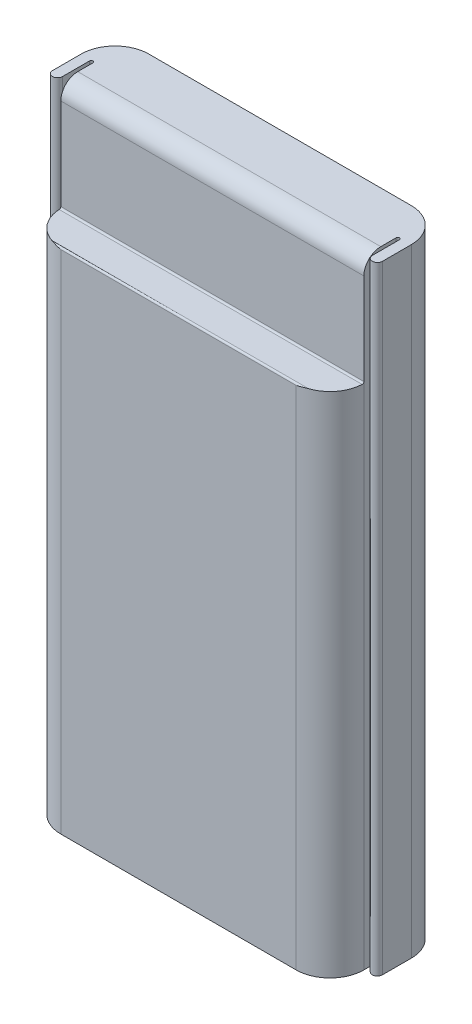
ISO-10303-21;
HEADER;
FILE_DESCRIPTION(('STEP AP214'),'2;1');
FILE_NAME('part.step','',(''),(''),'','','');
FILE_SCHEMA(('AUTOMOTIVE_DESIGN { 1 0 10303 214 1 1 1 1 }'));
ENDSEC;
DATA;
#1=APPLICATION_CONTEXT('core data for automotive mechanical design processes');
#2=APPLICATION_PROTOCOL_DEFINITION('international standard','automotive_design',2000,#1);
#3=PRODUCT_CONTEXT('',#1,'mechanical');
#4=PRODUCT('Part','Part','',(#3));
#5=PRODUCT_RELATED_PRODUCT_CATEGORY('part','',(#4));
#6=PRODUCT_DEFINITION_FORMATION('','',#4);
#7=PRODUCT_DEFINITION_CONTEXT('part definition',#1,'design');
#8=PRODUCT_DEFINITION('design','',#6,#7);
#9=PRODUCT_DEFINITION_SHAPE('','',#8);
#10=(LENGTH_UNIT() NAMED_UNIT(*) SI_UNIT(.MILLI.,.METRE.));
#11=(NAMED_UNIT(*) PLANE_ANGLE_UNIT() SI_UNIT($,.RADIAN.));
#12=(NAMED_UNIT(*) SI_UNIT($,.STERADIAN.) SOLID_ANGLE_UNIT());
#13=UNCERTAINTY_MEASURE_WITH_UNIT(LENGTH_MEASURE(1.E-05),#10,'distance_accuracy_value','');
#14=(GEOMETRIC_REPRESENTATION_CONTEXT(3) GLOBAL_UNCERTAINTY_ASSIGNED_CONTEXT((#13)) GLOBAL_UNIT_ASSIGNED_CONTEXT((#10,
#11,#12)) REPRESENTATION_CONTEXT('',''));
#15=CARTESIAN_POINT('',(0.,0.,0.));
#16=DIRECTION('',(0.,0.,1.));
#17=DIRECTION('',(1.,0.,0.));
#18=AXIS2_PLACEMENT_3D('',#15,#16,#17);
#19=CARTESIAN_POINT('',(-8.95,18.25,4.));
#20=DIRECTION('',(1.,0.,0.));
#21=DIRECTION('',(0.,0.,-1.));
#22=AXIS2_PLACEMENT_3D('',#19,#20,#21);
#23=PLANE('',#22);
#24=CARTESIAN_POINT('',(-8.95,17.25,3.));
#25=DIRECTION('',(1.,0.,0.));
#26=DIRECTION('',(0.,0.,-1.));
#27=AXIS2_PLACEMENT_3D('',#24,#25,#26);
#28=CIRCLE('',#27,1.);
#29=CARTESIAN_POINT('',(-8.95,18.25,3.));
#30=VERTEX_POINT('',#29);
#31=CARTESIAN_POINT('',(-8.95,17.25,4.));
#32=VERTEX_POINT('',#31);
#33=EDGE_CURVE('E452',#30,#32,#28,.T.);
#34=ORIENTED_EDGE('',*,*,#33,.F.);
#35=DIRECTION('',(0.,0.,1.));
#36=VECTOR('',#35,1.);
#37=CARTESIAN_POINT('',(-8.95,18.25,4.));
#38=LINE('',#37,#36);
#39=CARTESIAN_POINT('',(-8.95,18.25,2.1));
#40=VERTEX_POINT('',#39);
#41=EDGE_CURVE('E268',#40,#30,#38,.T.);
#42=ORIENTED_EDGE('',*,*,#41,.F.);
#43=DIRECTION('',(0.,-1.,0.));
#44=VECTOR('',#43,1.);
#45=CARTESIAN_POINT('',(-8.95,18.25,2.1));
#46=LINE('',#45,#44);
#47=CARTESIAN_POINT('',(-8.95,-18.25,2.1));
#48=VERTEX_POINT('',#47);
#49=EDGE_CURVE('E236',#40,#48,#46,.T.);
#50=ORIENTED_EDGE('',*,*,#49,.T.);
#51=DIRECTION('',(0.,0.,1.));
#52=VECTOR('',#51,1.);
#53=CARTESIAN_POINT('',(-8.95,-18.25,4.));
#54=LINE('',#53,#52);
#55=CARTESIAN_POINT('',(-8.95,-18.25,4.));
#56=VERTEX_POINT('',#55);
#57=EDGE_CURVE('E191',#48,#56,#54,.T.);
#58=ORIENTED_EDGE('',*,*,#57,.T.);
#59=DIRECTION('',(0.,-1.,0.));
#60=VECTOR('',#59,1.);
#61=CARTESIAN_POINT('',(-8.95,18.25,4.));
#62=LINE('',#61,#60);
#63=CARTESIAN_POINT('',(-8.95,11.85,4.));
#64=VERTEX_POINT('',#63);
#65=EDGE_CURVE('E234',#64,#56,#62,.T.);
#66=ORIENTED_EDGE('',*,*,#65,.F.);
#67=DIRECTION('',(0.,-1.,0.));
#68=VECTOR('',#67,1.);
#69=CARTESIAN_POINT('',(-8.95,18.25,4.));
#70=LINE('',#69,#68);
#71=EDGE_CURVE('E435',#32,#64,#70,.T.);
#72=ORIENTED_EDGE('',*,*,#71,.F.);
#73=EDGE_LOOP('',(#34,#42,#50,#58,#66,#72));
#74=FACE_BOUND('',#73,.T.);
#75=ADVANCED_FACE('F35',(#74),#23,.F.);
#76=CARTESIAN_POINT('',(-6.95,18.25,4.));
#77=DIRECTION('',(0.,-1.,0.));
#78=DIRECTION('',(0.,0.,-1.));
#79=AXIS2_PLACEMENT_3D('',#76,#77,#78);
#80=CYLINDRICAL_SURFACE('',#79,2.);
#81=CARTESIAN_POINT('',(-8.95,11.85,4.));
#82=CARTESIAN_POINT('',(-8.94999932422517,11.8443743102239,3.99999522201878));
#83=CARTESIAN_POINT('',(-8.94999998904104,11.8387500464261,4.00047444004767));
#84=CARTESIAN_POINT('',(-8.94999900312955,11.8276648866069,4.00236561548896));
#85=CARTESIAN_POINT('',(-8.94999735420724,11.822203866626,4.00377684534849));
#86=CARTESIAN_POINT('',(-8.94998675606316,11.8115938955208,4.00749778863902));
#87=CARTESIAN_POINT('',(-8.94997780332464,11.8064450960132,4.00980793461507));
#88=CARTESIAN_POINT('',(-8.94994365144838,11.7966092606749,4.01525910036643));
#89=CARTESIAN_POINT('',(-8.94991845516527,11.7919221438755,4.01839997409343));
#90=CARTESIAN_POINT('',(-8.94984147568946,11.7831423208407,4.02542348470254));
#91=CARTESIAN_POINT('',(-8.94978969553752,11.7790495466912,4.02930603671727));
#92=CARTESIAN_POINT('',(-8.9496489797193,11.771573258672,4.03770353610332));
#93=CARTESIAN_POINT('',(-8.94956003717822,11.7681898762095,4.04221860038278));
#94=CARTESIAN_POINT('',(-8.94933604675531,11.762230184252,4.05175006414675));
#95=CARTESIAN_POINT('',(-8.94920101025261,11.7596536758662,4.05676633968216));
#96=CARTESIAN_POINT('',(-8.94887888497684,11.7553802774274,4.06715763512218));
#97=CARTESIAN_POINT('',(-8.94869182588129,11.7536828874362,4.07253244916511));
#98=CARTESIAN_POINT('',(-8.94833726279508,11.7516345170711,4.08161655952931));
#99=CARTESIAN_POINT('',(-8.94818479897542,11.7510218606214,4.08526960373832));
#100=CARTESIAN_POINT('',(-8.94785788686203,11.7502046519005,4.09261477614858));
#101=CARTESIAN_POINT('',(-8.9476834703334,11.7499995170115,4.09630684095527));
#102=CARTESIAN_POINT('',(-8.94749843554385,11.7499999999995,4.0999999999999));
#103=B_SPLINE_CURVE_WITH_KNOTS('',3,(#81,#82,#83,#84,#85,#86,#87,#88,#89,#90,#91,#92,#93,#94,
#95,#96,#97,#98,#99,#100,#101,#102),.UNSPECIFIED.,.F.,.F.,(4,2,2,2,2,2,2,2,2,2,4),(0.,
0.0168546524917242,0.0336961633269723,0.0505457880879403,0.0673924525224765,0.0842371904116673,
0.101085045855895,0.117928745104641,0.134762855110015,0.145863232784876,0.156947729226478),.UNSPECIFIED.);
#104=CARTESIAN_POINT('',(-8.94749843554382,11.75,4.1));
#105=VERTEX_POINT('',#104);
#106=EDGE_CURVE('E432',#64,#105,#103,.T.);
#107=ORIENTED_EDGE('',*,*,#106,.F.);
#108=ORIENTED_EDGE('',*,*,#65,.T.);
#109=CARTESIAN_POINT('',(-6.95,-18.25,4.));
#110=DIRECTION('',(0.,1.,0.));
#111=DIRECTION('',(0.,0.,1.));
#112=AXIS2_PLACEMENT_3D('',#109,#110,#111);
#113=CIRCLE('',#112,2.);
#114=CARTESIAN_POINT('',(-6.95,-18.25,6.));
#115=VERTEX_POINT('',#114);
#116=EDGE_CURVE('E194',#56,#115,#113,.T.);
#117=ORIENTED_EDGE('',*,*,#116,.T.);
#118=DIRECTION('',(0.,-1.,0.));
#119=VECTOR('',#118,1.);
#120=CARTESIAN_POINT('',(-6.95,18.25,6.));
#121=LINE('',#120,#119);
#122=CARTESIAN_POINT('',(-6.95,11.65,6.));
#123=VERTEX_POINT('',#122);
#124=EDGE_CURVE('E232',#123,#115,#121,.T.);
#125=ORIENTED_EDGE('',*,*,#124,.F.);
#126=CARTESIAN_POINT('',(-7.57449979983984,11.75,5.9));
#127=CARTESIAN_POINT('',(-7.55856334148589,11.7499927516954,5.90523837613631));
#128=CARTESIAN_POINT('',(-7.54256714931025,11.74958905733,5.91027359012637));
#129=CARTESIAN_POINT('',(-7.51049053402888,11.748117177134,5.91992979603773));
#130=CARTESIAN_POINT('',(-7.4944101692403,11.747049403092,5.92455104262571));
#131=CARTESIAN_POINT('',(-7.44610574696767,11.7430447612974,5.93778043517835));
#132=CARTESIAN_POINT('',(-7.41377882782681,11.7393059211048,5.94576720996326));
#133=CARTESIAN_POINT('',(-7.3113781263724,11.7252140333343,5.96838648267485));
#134=CARTESIAN_POINT('',(-7.24100224492483,11.7122186682412,5.97998574983881));
#135=CARTESIAN_POINT('',(-7.0999810808278,11.6834815244392,5.99563165048736));
#136=CARTESIAN_POINT('',(-7.02933564546196,11.6677378515745,5.99967305238183));
#137=CARTESIAN_POINT('',(-6.95581908702235,11.6513011877615,5.99999364048357));
#138=CARTESIAN_POINT('',(-6.95290950558759,11.6506505834764,5.99999998856282));
#139=CARTESIAN_POINT('',(-6.95,11.65,6.));
#140=B_SPLINE_CURVE_WITH_KNOTS('',3,(#126,#127,#128,#129,#130,#131,#132,#133,#134,#135,#136,
#137,#138,#139),.UNSPECIFIED.,.F.,.F.,(4,2,2,2,2,2,4),(0.,0.0503101558894608,0.100589146054153,
0.201022717159537,0.417919206283149,0.634965776691355,0.643910069210359),.UNSPECIFIED.);
#141=CARTESIAN_POINT('',(-7.57449979983984,11.75,5.9));
#142=VERTEX_POINT('',#141);
#143=EDGE_CURVE('E433',#142,#123,#140,.T.);
#144=ORIENTED_EDGE('',*,*,#143,.F.);
#145=CARTESIAN_POINT('',(-6.95,11.75,4.));
#146=DIRECTION('',(0.,-1.,0.));
#147=DIRECTION('',(0.,0.,-1.));
#148=AXIS2_PLACEMENT_3D('',#145,#146,#147);
#149=CIRCLE('',#148,2.);
#150=EDGE_CURVE('E426',#105,#142,#149,.F.);
#151=ORIENTED_EDGE('',*,*,#150,.F.);
#152=EDGE_LOOP('',(#107,#108,#117,#125,#144,#151));
#153=FACE_BOUND('',#152,.T.);
#154=ADVANCED_FACE('F360',(#153),#80,.T.);
#155=CARTESIAN_POINT('',(6.95,18.25,4.));
#156=DIRECTION('',(0.,-1.,0.));
#157=DIRECTION('',(0.,0.,-1.));
#158=AXIS2_PLACEMENT_3D('',#155,#156,#157);
#159=CYLINDRICAL_SURFACE('',#158,2.);
#160=CARTESIAN_POINT('',(8.95,11.85,4.));
#161=CARTESIAN_POINT('',(8.94999932422517,11.8443743102239,3.99999522201878));
#162=CARTESIAN_POINT('',(8.94999998904103,11.8387500464261,4.00047444004767));
#163=CARTESIAN_POINT('',(8.94999900312954,11.8276648866069,4.00236561548896));
#164=CARTESIAN_POINT('',(8.94999735420723,11.822203866626,4.00377684534849));
#165=CARTESIAN_POINT('',(8.94998675606316,11.8115938955208,4.00749778863902));
#166=CARTESIAN_POINT('',(8.94997780332464,11.8064450960132,4.00980793461507));
#167=CARTESIAN_POINT('',(8.94994365144838,11.7966092606749,4.01525910036643));
#168=CARTESIAN_POINT('',(8.94991845516526,11.7919221438755,4.01839997409343));
#169=CARTESIAN_POINT('',(8.94984147568946,11.7831423208407,4.02542348470254));
#170=CARTESIAN_POINT('',(8.94978969553751,11.7790495466912,4.02930603671727));
#171=CARTESIAN_POINT('',(8.9496489797193,11.771573258672,4.03770353610332));
#172=CARTESIAN_POINT('',(8.94956003717822,11.7681898762095,4.04221860038278));
#173=CARTESIAN_POINT('',(8.9493360467553,11.762230184252,4.05175006414675));
#174=CARTESIAN_POINT('',(8.9492010102526,11.7596536758662,4.05676633968216));
#175=CARTESIAN_POINT('',(8.94887888497684,11.7553802774274,4.06715763512218));
#176=CARTESIAN_POINT('',(8.94869182588128,11.7536828874362,4.07253244916511));
#177=CARTESIAN_POINT('',(8.94833726279507,11.7516345170711,4.08161655952931));
#178=CARTESIAN_POINT('',(8.94818479897542,11.7510218606214,4.08526960373832));
#179=CARTESIAN_POINT('',(8.94785788686202,11.7502046519005,4.09261477614858));
#180=CARTESIAN_POINT('',(8.94768347033339,11.7499995170115,4.09630684095527));
#181=CARTESIAN_POINT('',(8.94749843554384,11.7499999999995,4.0999999999999));
#182=B_SPLINE_CURVE_WITH_KNOTS('',3,(#160,#161,#162,#163,#164,#165,#166,#167,#168,#169,#170,
#171,#172,#173,#174,#175,#176,#177,#178,#179,#180,#181),.UNSPECIFIED.,.F.,.F.,(4,2,2,2,2,2,2,2,
2,2,4),(0.,0.0168546524917242,0.0336961633269723,0.0505457880879403,0.0673924525224765,
0.0842371904116674,0.101085045855895,0.117928745104641,0.134762855110015,0.145863232784877,
0.156947729226477),.UNSPECIFIED.);
#183=CARTESIAN_POINT('',(8.95,11.85,4.));
#184=VERTEX_POINT('',#183);
#185=CARTESIAN_POINT('',(8.94749843554382,11.75,4.1));
#186=VERTEX_POINT('',#185);
#187=EDGE_CURVE('E339',#184,#186,#182,.T.);
#188=ORIENTED_EDGE('',*,*,#187,.T.);
#189=CARTESIAN_POINT('',(6.95,11.75,4.));
#190=DIRECTION('',(0.,1.,0.));
#191=DIRECTION('',(0.,0.,1.));
#192=AXIS2_PLACEMENT_3D('',#189,#190,#191);
#193=CIRCLE('',#192,2.);
#194=CARTESIAN_POINT('',(7.57449979983984,11.75,5.9));
#195=VERTEX_POINT('',#194);
#196=EDGE_CURVE('E325',#186,#195,#193,.F.);
#197=ORIENTED_EDGE('',*,*,#196,.T.);
#198=CARTESIAN_POINT('',(7.57449979983984,11.75,5.9));
#199=CARTESIAN_POINT('',(7.55856334148588,11.7499927516954,5.90523837613631));
#200=CARTESIAN_POINT('',(7.54256714931024,11.74958905733,5.91027359012637));
#201=CARTESIAN_POINT('',(7.51049053402887,11.748117177134,5.91992979603774));
#202=CARTESIAN_POINT('',(7.49441016924029,11.747049403092,5.92455104262571));
#203=CARTESIAN_POINT('',(7.44610574696766,11.7430447612974,5.93778043517835));
#204=CARTESIAN_POINT('',(7.41377882782681,11.7393059211048,5.94576720996326));
#205=CARTESIAN_POINT('',(7.31137812637239,11.7252140333343,5.96838648267485));
#206=CARTESIAN_POINT('',(7.24100224492482,11.7122186682413,5.9799857498388));
#207=CARTESIAN_POINT('',(7.09998108082782,11.6834815244391,5.99563165048736));
#208=CARTESIAN_POINT('',(7.02933564546204,11.6677378515741,5.99967305238184));
#209=CARTESIAN_POINT('',(6.95581908702235,11.6513011877615,5.99999364048357));
#210=CARTESIAN_POINT('',(6.95290950558759,11.6506505834764,5.99999998856282));
#211=CARTESIAN_POINT('',(6.95,11.65,6.));
#212=B_SPLINE_CURVE_WITH_KNOTS('',3,(#198,#199,#200,#201,#202,#203,#204,#205,#206,#207,#208,
#209,#210,#211),.UNSPECIFIED.,.F.,.F.,(4,2,2,2,2,2,4),(0.,0.0503101558894679,0.100589146054166,
0.201022717159536,0.417919206283143,0.634965776691358,0.643910069210361),.UNSPECIFIED.);
#213=CARTESIAN_POINT('',(6.95,11.65,6.));
#214=VERTEX_POINT('',#213);
#215=EDGE_CURVE('E316',#195,#214,#212,.T.);
#216=ORIENTED_EDGE('',*,*,#215,.T.);
#217=DIRECTION('',(0.,-1.,0.));
#218=VECTOR('',#217,1.);
#219=CARTESIAN_POINT('',(6.95,18.25,6.));
#220=LINE('',#219,#218);
#221=CARTESIAN_POINT('',(6.95,-18.25,6.));
#222=VERTEX_POINT('',#221);
#223=EDGE_CURVE('E230',#214,#222,#220,.T.);
#224=ORIENTED_EDGE('',*,*,#223,.T.);
#225=CARTESIAN_POINT('',(6.95,-18.25,4.));
#226=DIRECTION('',(0.,1.,0.));
#227=DIRECTION('',(0.,0.,-1.));
#228=AXIS2_PLACEMENT_3D('',#225,#226,#227);
#229=CIRCLE('',#228,2.);
#230=CARTESIAN_POINT('',(8.95,-18.25,4.));
#231=VERTEX_POINT('',#230);
#232=EDGE_CURVE('E200',#222,#231,#229,.T.);
#233=ORIENTED_EDGE('',*,*,#232,.T.);
#234=DIRECTION('',(0.,-1.,0.));
#235=VECTOR('',#234,1.);
#236=CARTESIAN_POINT('',(8.95,18.25,4.));
#237=LINE('',#236,#235);
#238=EDGE_CURVE('E228',#184,#231,#237,.T.);
#239=ORIENTED_EDGE('',*,*,#238,.F.);
#240=EDGE_LOOP('',(#188,#197,#216,#224,#233,#239));
#241=FACE_BOUND('',#240,.T.);
#242=ADVANCED_FACE('F366',(#241),#159,.T.);
#243=CARTESIAN_POINT('',(8.95,18.25,2.1));
#244=DIRECTION('',(-1.,0.,0.));
#245=DIRECTION('',(0.,0.,1.));
#246=AXIS2_PLACEMENT_3D('',#243,#244,#245);
#247=PLANE('',#246);
#248=CARTESIAN_POINT('',(8.95,17.25,3.));
#249=DIRECTION('',(-1.,0.,0.));
#250=DIRECTION('',(0.,0.,1.));
#251=AXIS2_PLACEMENT_3D('',#248,#249,#250);
#252=CIRCLE('',#251,1.);
#253=CARTESIAN_POINT('',(8.95,18.25,3.));
#254=VERTEX_POINT('',#253);
#255=CARTESIAN_POINT('',(8.95,17.25,4.));
#256=VERTEX_POINT('',#255);
#257=EDGE_CURVE('E50',#254,#256,#252,.F.);
#258=ORIENTED_EDGE('',*,*,#257,.T.);
#259=DIRECTION('',(0.,-1.,0.));
#260=VECTOR('',#259,1.);
#261=CARTESIAN_POINT('',(8.95,17.25,4.));
#262=LINE('',#261,#260);
#263=EDGE_CURVE('E183',#256,#184,#262,.T.);
#264=ORIENTED_EDGE('',*,*,#263,.T.);
#265=ORIENTED_EDGE('',*,*,#238,.T.);
#266=DIRECTION('',(0.,0.,-1.));
#267=VECTOR('',#266,1.);
#268=CARTESIAN_POINT('',(8.95,-18.25,2.1));
#269=LINE('',#268,#267);
#270=CARTESIAN_POINT('',(8.95,-18.25,2.1));
#271=VERTEX_POINT('',#270);
#272=EDGE_CURVE('E203',#231,#271,#269,.T.);
#273=ORIENTED_EDGE('',*,*,#272,.T.);
#274=DIRECTION('',(0.,-1.,0.));
#275=VECTOR('',#274,1.);
#276=CARTESIAN_POINT('',(8.95,18.25,2.1));
#277=LINE('',#276,#275);
#278=CARTESIAN_POINT('',(8.95,18.25,2.1));
#279=VERTEX_POINT('',#278);
#280=EDGE_CURVE('E225',#279,#271,#277,.T.);
#281=ORIENTED_EDGE('',*,*,#280,.F.);
#282=DIRECTION('',(0.,0.,-1.));
#283=VECTOR('',#282,1.);
#284=CARTESIAN_POINT('',(8.95,18.25,2.1));
#285=LINE('',#284,#283);
#286=EDGE_CURVE('E271',#254,#279,#285,.T.);
#287=ORIENTED_EDGE('',*,*,#286,.F.);
#288=EDGE_LOOP('',(#258,#264,#265,#273,#281,#287));
#289=FACE_BOUND('',#288,.T.);
#290=ADVANCED_FACE('F383',(#289),#247,.F.);
#291=CARTESIAN_POINT('',(-7.75,18.25,2.));
#292=DIRECTION('',(0.,-1.,0.));
#293=DIRECTION('',(0.,0.,-1.));
#294=AXIS2_PLACEMENT_3D('',#291,#292,#293);
#295=CYLINDRICAL_SURFACE('',#294,2.);
#296=CARTESIAN_POINT('',(-7.75,-18.25,2.));
#297=DIRECTION('',(0.,1.,0.));
#298=DIRECTION('',(0.,0.,1.));
#299=AXIS2_PLACEMENT_3D('',#296,#297,#298);
#300=CIRCLE('',#299,2.);
#301=CARTESIAN_POINT('',(-7.75,-18.25,0.));
#302=VERTEX_POINT('',#301);
#303=CARTESIAN_POINT('',(-9.75,-18.25,2.));
#304=VERTEX_POINT('',#303);
#305=EDGE_CURVE('E179',#302,#304,#300,.T.);
#306=ORIENTED_EDGE('',*,*,#305,.T.);
#307=DIRECTION('',(0.,-1.,0.));
#308=VECTOR('',#307,1.);
#309=CARTESIAN_POINT('',(-9.75,18.25,2.));
#310=LINE('',#309,#308);
#311=CARTESIAN_POINT('',(-9.75,18.25,2.));
#312=VERTEX_POINT('',#311);
#313=EDGE_CURVE('E11',#312,#304,#310,.T.);
#314=ORIENTED_EDGE('',*,*,#313,.F.);
#315=CARTESIAN_POINT('',(-7.75,18.25,2.));
#316=DIRECTION('',(0.,1.,0.));
#317=DIRECTION('',(0.,0.,1.));
#318=AXIS2_PLACEMENT_3D('',#315,#316,#317);
#319=CIRCLE('',#318,2.);
#320=CARTESIAN_POINT('',(-7.75,18.25,0.));
#321=VERTEX_POINT('',#320);
#322=EDGE_CURVE('E215',#321,#312,#319,.T.);
#323=ORIENTED_EDGE('',*,*,#322,.F.);
#324=DIRECTION('',(0.,-1.,0.));
#325=VECTOR('',#324,1.);
#326=CARTESIAN_POINT('',(-7.75,18.25,0.));
#327=LINE('',#326,#325);
#328=EDGE_CURVE('E175',#321,#302,#327,.T.);
#329=ORIENTED_EDGE('',*,*,#328,.T.);
#330=EDGE_LOOP('',(#306,#314,#323,#329));
#331=FACE_BOUND('',#330,.T.);
#332=ADVANCED_FACE('F37',(#331),#295,.T.);
#333=CARTESIAN_POINT('',(-9.75,18.25,2.));
#334=DIRECTION('',(1.,0.,0.));
#335=DIRECTION('',(0.,0.,-1.));
#336=AXIS2_PLACEMENT_3D('',#333,#334,#335);
#337=PLANE('',#336);
#338=DIRECTION('',(0.,0.,1.));
#339=VECTOR('',#338,1.);
#340=CARTESIAN_POINT('',(-9.75,-18.25,2.));
#341=LINE('',#340,#339);
#342=CARTESIAN_POINT('',(-9.75,-18.25,3.7));
#343=VERTEX_POINT('',#342);
#344=EDGE_CURVE('E182',#304,#343,#341,.T.);
#345=ORIENTED_EDGE('',*,*,#344,.T.);
#346=DIRECTION('',(0.,-1.,0.));
#347=VECTOR('',#346,1.);
#348=CARTESIAN_POINT('',(-9.75,18.25,3.7));
#349=LINE('',#348,#347);
#350=CARTESIAN_POINT('',(-9.75,18.25,3.7));
#351=VERTEX_POINT('',#350);
#352=EDGE_CURVE('E43',#351,#343,#349,.T.);
#353=ORIENTED_EDGE('',*,*,#352,.F.);
#354=DIRECTION('',(0.,0.,1.));
#355=VECTOR('',#354,1.);
#356=CARTESIAN_POINT('',(-9.75,18.25,2.));
#357=LINE('',#356,#355);
#358=EDGE_CURVE('E124',#312,#351,#357,.T.);
#359=ORIENTED_EDGE('',*,*,#358,.F.);
#360=ORIENTED_EDGE('',*,*,#313,.T.);
#361=EDGE_LOOP('',(#345,#353,#359,#360));
#362=FACE_BOUND('',#361,.T.);
#363=ADVANCED_FACE('F378',(#362),#337,.F.);
#364=CARTESIAN_POINT('',(-9.45,18.25,3.7));
#365=DIRECTION('',(0.,-1.,0.));
#366=DIRECTION('',(0.,0.,-1.));
#367=AXIS2_PLACEMENT_3D('',#364,#365,#366);
#368=CYLINDRICAL_SURFACE('',#367,0.299999999999998);
#369=CARTESIAN_POINT('',(-9.45,-18.25,3.7));
#370=DIRECTION('',(0.,1.,0.));
#371=DIRECTION('',(0.,0.,1.));
#372=AXIS2_PLACEMENT_3D('',#369,#370,#371);
#373=CIRCLE('',#372,0.299999999999998);
#374=CARTESIAN_POINT('',(-9.15,-18.25,3.7));
#375=VERTEX_POINT('',#374);
#376=EDGE_CURVE('E185',#343,#375,#373,.T.);
#377=ORIENTED_EDGE('',*,*,#376,.T.);
#378=DIRECTION('',(0.,-1.,0.));
#379=VECTOR('',#378,1.);
#380=CARTESIAN_POINT('',(-9.15,18.25,3.7));
#381=LINE('',#380,#379);
#382=CARTESIAN_POINT('',(-9.15,18.25,3.7));
#383=VERTEX_POINT('',#382);
#384=EDGE_CURVE('E242',#383,#375,#381,.T.);
#385=ORIENTED_EDGE('',*,*,#384,.F.);
#386=CARTESIAN_POINT('',(-9.45,18.25,3.7));
#387=DIRECTION('',(0.,1.,0.));
#388=DIRECTION('',(0.,0.,1.));
#389=AXIS2_PLACEMENT_3D('',#386,#387,#388);
#390=CIRCLE('',#389,0.299999999999998);
#391=EDGE_CURVE('E250',#351,#383,#390,.T.);
#392=ORIENTED_EDGE('',*,*,#391,.F.);
#393=ORIENTED_EDGE('',*,*,#352,.T.);
#394=EDGE_LOOP('',(#377,#385,#392,#393));
#395=FACE_BOUND('',#394,.T.);
#396=ADVANCED_FACE('F248',(#395),#368,.T.);
#397=CARTESIAN_POINT('',(-9.15,18.25,3.7));
#398=DIRECTION('',(-1.,0.,0.));
#399=DIRECTION('',(0.,0.,1.));
#400=AXIS2_PLACEMENT_3D('',#397,#398,#399);
#401=PLANE('',#400);
#402=DIRECTION('',(0.,0.,-1.));
#403=VECTOR('',#402,1.);
#404=CARTESIAN_POINT('',(-9.15,-18.25,3.7));
#405=LINE('',#404,#403);
#406=CARTESIAN_POINT('',(-9.15,-18.25,2.1));
#407=VERTEX_POINT('',#406);
#408=EDGE_CURVE('E187',#375,#407,#405,.T.);
#409=ORIENTED_EDGE('',*,*,#408,.T.);
#410=DIRECTION('',(0.,-1.,0.));
#411=VECTOR('',#410,1.);
#412=CARTESIAN_POINT('',(-9.15,18.25,2.1));
#413=LINE('',#412,#411);
#414=CARTESIAN_POINT('',(-9.15,18.25,2.1));
#415=VERTEX_POINT('',#414);
#416=EDGE_CURVE('E239',#415,#407,#413,.T.);
#417=ORIENTED_EDGE('',*,*,#416,.F.);
#418=DIRECTION('',(0.,0.,-1.));
#419=VECTOR('',#418,1.);
#420=CARTESIAN_POINT('',(-9.15,18.25,3.7));
#421=LINE('',#420,#419);
#422=EDGE_CURVE('E269',#383,#415,#421,.T.);
#423=ORIENTED_EDGE('',*,*,#422,.F.);
#424=ORIENTED_EDGE('',*,*,#384,.T.);
#425=EDGE_LOOP('',(#409,#417,#423,#424));
#426=FACE_BOUND('',#425,.T.);
#427=ADVANCED_FACE('F259',(#426),#401,.F.);
#428=CARTESIAN_POINT('',(-9.05,18.25,2.1));
#429=DIRECTION('',(0.,-1.,0.));
#430=DIRECTION('',(0.,0.,-1.));
#431=AXIS2_PLACEMENT_3D('',#428,#429,#430);
#432=CYLINDRICAL_SURFACE('',#431,0.100000000000001);
#433=CARTESIAN_POINT('',(-9.05,-18.25,2.1));
#434=DIRECTION('',(0.,-1.,0.));
#435=DIRECTION('',(0.,0.,1.));
#436=AXIS2_PLACEMENT_3D('',#433,#434,#435);
#437=CIRCLE('',#436,0.100000000000001);
#438=EDGE_CURVE('E189',#407,#48,#437,.T.);
#439=ORIENTED_EDGE('',*,*,#438,.T.);
#440=ORIENTED_EDGE('',*,*,#49,.F.);
#441=CARTESIAN_POINT('',(-9.05,18.25,2.1));
#442=DIRECTION('',(0.,-1.,0.));
#443=DIRECTION('',(0.,0.,1.));
#444=AXIS2_PLACEMENT_3D('',#441,#442,#443);
#445=CIRCLE('',#444,0.100000000000001);
#446=EDGE_CURVE('E265',#415,#40,#445,.T.);
#447=ORIENTED_EDGE('',*,*,#446,.F.);
#448=ORIENTED_EDGE('',*,*,#416,.T.);
#449=EDGE_LOOP('',(#439,#440,#447,#448));
#450=FACE_BOUND('',#449,.T.);
#451=ADVANCED_FACE('F263',(#450),#432,.F.);
#452=CARTESIAN_POINT('',(-6.95,18.25,6.));
#453=DIRECTION('',(0.,0.,-1.));
#454=DIRECTION('',(-1.,0.,0.));
#455=AXIS2_PLACEMENT_3D('',#452,#453,#454);
#456=PLANE('',#455);
#457=ORIENTED_EDGE('',*,*,#223,.F.);
#458=DIRECTION('',(-1.,0.,0.));
#459=VECTOR('',#458,1.);
#460=CARTESIAN_POINT('',(9.751,11.65,6.));
#461=LINE('',#460,#459);
#462=EDGE_CURVE('E301',#214,#123,#461,.T.);
#463=ORIENTED_EDGE('',*,*,#462,.T.);
#464=ORIENTED_EDGE('',*,*,#124,.T.);
#465=DIRECTION('',(1.,0.,0.));
#466=VECTOR('',#465,1.);
#467=CARTESIAN_POINT('',(-6.95,-18.25,6.));
#468=LINE('',#467,#466);
#469=EDGE_CURVE('E197',#115,#222,#468,.T.);
#470=ORIENTED_EDGE('',*,*,#469,.T.);
#471=EDGE_LOOP('',(#457,#463,#464,#470));
#472=FACE_BOUND('',#471,.T.);
#473=ADVANCED_FACE('F374',(#472),#456,.F.);
#474=CARTESIAN_POINT('',(9.05,18.25,2.1));
#475=DIRECTION('',(0.,-1.,0.));
#476=DIRECTION('',(0.,0.,-1.));
#477=AXIS2_PLACEMENT_3D('',#474,#475,#476);
#478=CYLINDRICAL_SURFACE('',#477,0.0999999999999977);
#479=CARTESIAN_POINT('',(9.05,-18.25,2.1));
#480=DIRECTION('',(0.,-1.,0.));
#481=DIRECTION('',(0.,0.,-1.));
#482=AXIS2_PLACEMENT_3D('',#479,#480,#481);
#483=CIRCLE('',#482,0.0999999999999977);
#484=CARTESIAN_POINT('',(9.14999999999999,-18.25,2.1));
#485=VERTEX_POINT('',#484);
#486=EDGE_CURVE('E205',#271,#485,#483,.T.);
#487=ORIENTED_EDGE('',*,*,#486,.T.);
#488=DIRECTION('',(0.,-1.,0.));
#489=VECTOR('',#488,1.);
#490=CARTESIAN_POINT('',(9.14999999999999,18.25,2.1));
#491=LINE('',#490,#489);
#492=CARTESIAN_POINT('',(9.14999999999999,18.25,2.1));
#493=VERTEX_POINT('',#492);
#494=EDGE_CURVE('E222',#493,#485,#491,.T.);
#495=ORIENTED_EDGE('',*,*,#494,.F.);
#496=CARTESIAN_POINT('',(9.05,18.25,2.1));
#497=DIRECTION('',(0.,-1.,0.));
#498=DIRECTION('',(0.,0.,-1.));
#499=AXIS2_PLACEMENT_3D('',#496,#497,#498);
#500=CIRCLE('',#499,0.0999999999999977);
#501=EDGE_CURVE('E277',#279,#493,#500,.T.);
#502=ORIENTED_EDGE('',*,*,#501,.F.);
#503=ORIENTED_EDGE('',*,*,#280,.T.);
#504=EDGE_LOOP('',(#487,#495,#502,#503));
#505=FACE_BOUND('',#504,.T.);
#506=ADVANCED_FACE('F395',(#505),#478,.F.);
#507=CARTESIAN_POINT('',(9.14999999999998,18.25,3.70000000000002));
#508=DIRECTION('',(1.,0.,0.));
#509=DIRECTION('',(0.,0.,-1.));
#510=AXIS2_PLACEMENT_3D('',#507,#508,#509);
#511=PLANE('',#510);
#512=DIRECTION('',(0.,0.,1.));
#513=VECTOR('',#512,1.);
#514=CARTESIAN_POINT('',(9.14999999999998,-18.25,3.70000000000002));
#515=LINE('',#514,#513);
#516=CARTESIAN_POINT('',(9.14999999999998,-18.25,3.70000000000002));
#517=VERTEX_POINT('',#516);
#518=EDGE_CURVE('E207',#485,#517,#515,.T.);
#519=ORIENTED_EDGE('',*,*,#518,.T.);
#520=DIRECTION('',(0.,-1.,0.));
#521=VECTOR('',#520,1.);
#522=CARTESIAN_POINT('',(9.14999999999998,18.25,3.70000000000002));
#523=LINE('',#522,#521);
#524=CARTESIAN_POINT('',(9.14999999999998,18.25,3.70000000000002));
#525=VERTEX_POINT('',#524);
#526=EDGE_CURVE('E219',#525,#517,#523,.T.);
#527=ORIENTED_EDGE('',*,*,#526,.F.);
#528=DIRECTION('',(0.,0.,1.));
#529=VECTOR('',#528,1.);
#530=CARTESIAN_POINT('',(9.14999999999998,18.25,3.70000000000002));
#531=LINE('',#530,#529);
#532=EDGE_CURVE('E279',#493,#525,#531,.T.);
#533=ORIENTED_EDGE('',*,*,#532,.F.);
#534=ORIENTED_EDGE('',*,*,#494,.T.);
#535=EDGE_LOOP('',(#519,#527,#533,#534));
#536=FACE_BOUND('',#535,.T.);
#537=ADVANCED_FACE('F285',(#536),#511,.F.);
#538=CARTESIAN_POINT('',(9.44999999999999,18.25,3.70000000000002));
#539=DIRECTION('',(0.,-1.,0.));
#540=DIRECTION('',(0.,0.,-1.));
#541=AXIS2_PLACEMENT_3D('',#538,#539,#540);
#542=CYLINDRICAL_SURFACE('',#541,0.300000000000009);
#543=CARTESIAN_POINT('',(9.44999999999999,-18.25,3.70000000000002));
#544=DIRECTION('',(0.,1.,0.));
#545=DIRECTION('',(0.,0.,-1.));
#546=AXIS2_PLACEMENT_3D('',#543,#544,#545);
#547=CIRCLE('',#546,0.300000000000009);
#548=CARTESIAN_POINT('',(9.75,-18.25,3.70000000000002));
#549=VERTEX_POINT('',#548);
#550=EDGE_CURVE('E209',#517,#549,#547,.T.);
#551=ORIENTED_EDGE('',*,*,#550,.T.);
#552=DIRECTION('',(0.,-1.,0.));
#553=VECTOR('',#552,1.);
#554=CARTESIAN_POINT('',(9.75,18.25,3.70000000000002));
#555=LINE('',#554,#553);
#556=CARTESIAN_POINT('',(9.75,18.25,3.70000000000002));
#557=VERTEX_POINT('',#556);
#558=EDGE_CURVE('E170',#557,#549,#555,.T.);
#559=ORIENTED_EDGE('',*,*,#558,.F.);
#560=CARTESIAN_POINT('',(9.44999999999999,18.25,3.70000000000002));
#561=DIRECTION('',(0.,1.,0.));
#562=DIRECTION('',(0.,0.,-1.));
#563=AXIS2_PLACEMENT_3D('',#560,#561,#562);
#564=CIRCLE('',#563,0.300000000000009);
#565=EDGE_CURVE('E158',#525,#557,#564,.T.);
#566=ORIENTED_EDGE('',*,*,#565,.F.);
#567=ORIENTED_EDGE('',*,*,#526,.T.);
#568=EDGE_LOOP('',(#551,#559,#566,#567));
#569=FACE_BOUND('',#568,.T.);
#570=ADVANCED_FACE('F289',(#569),#542,.T.);
#571=CARTESIAN_POINT('',(9.75,18.25,2.));
#572=DIRECTION('',(-1.,0.,0.));
#573=DIRECTION('',(0.,0.,1.));
#574=AXIS2_PLACEMENT_3D('',#571,#572,#573);
#575=PLANE('',#574);
#576=DIRECTION('',(0.,0.,-1.));
#577=VECTOR('',#576,1.);
#578=CARTESIAN_POINT('',(9.75,-18.25,2.));
#579=LINE('',#578,#577);
#580=CARTESIAN_POINT('',(9.75,-18.25,2.));
#581=VERTEX_POINT('',#580);
#582=EDGE_CURVE('E167',#549,#581,#579,.T.);
#583=ORIENTED_EDGE('',*,*,#582,.T.);
#584=DIRECTION('',(0.,-1.,0.));
#585=VECTOR('',#584,1.);
#586=CARTESIAN_POINT('',(9.75,18.25,2.));
#587=LINE('',#586,#585);
#588=CARTESIAN_POINT('',(9.75,18.25,2.));
#589=VERTEX_POINT('',#588);
#590=EDGE_CURVE('E164',#589,#581,#587,.T.);
#591=ORIENTED_EDGE('',*,*,#590,.F.);
#592=DIRECTION('',(0.,0.,-1.));
#593=VECTOR('',#592,1.);
#594=CARTESIAN_POINT('',(9.75,18.25,2.));
#595=LINE('',#594,#593);
#596=EDGE_CURVE('E151',#557,#589,#595,.T.);
#597=ORIENTED_EDGE('',*,*,#596,.F.);
#598=ORIENTED_EDGE('',*,*,#558,.T.);
#599=EDGE_LOOP('',(#583,#591,#597,#598));
#600=FACE_BOUND('',#599,.T.);
#601=ADVANCED_FACE('F165',(#600),#575,.F.);
#602=CARTESIAN_POINT('',(7.75,18.25,2.));
#603=DIRECTION('',(0.,-1.,0.));
#604=DIRECTION('',(0.,0.,-1.));
#605=AXIS2_PLACEMENT_3D('',#602,#603,#604);
#606=CYLINDRICAL_SURFACE('',#605,2.);
#607=CARTESIAN_POINT('',(7.75,-18.25,2.));
#608=DIRECTION('',(0.,1.,0.));
#609=DIRECTION('',(0.,0.,-1.));
#610=AXIS2_PLACEMENT_3D('',#607,#608,#609);
#611=CIRCLE('',#610,2.);
#612=CARTESIAN_POINT('',(7.75,-18.25,0.));
#613=VERTEX_POINT('',#612);
#614=EDGE_CURVE('E212',#581,#613,#611,.T.);
#615=ORIENTED_EDGE('',*,*,#614,.T.);
#616=DIRECTION('',(0.,-1.,0.));
#617=VECTOR('',#616,1.);
#618=CARTESIAN_POINT('',(7.75,18.25,0.));
#619=LINE('',#618,#617);
#620=CARTESIAN_POINT('',(7.75,18.25,0.));
#621=VERTEX_POINT('',#620);
#622=EDGE_CURVE('E171',#621,#613,#619,.T.);
#623=ORIENTED_EDGE('',*,*,#622,.F.);
#624=CARTESIAN_POINT('',(7.75,18.25,2.));
#625=DIRECTION('',(0.,1.,0.));
#626=DIRECTION('',(0.,0.,-1.));
#627=AXIS2_PLACEMENT_3D('',#624,#625,#626);
#628=CIRCLE('',#627,2.);
#629=EDGE_CURVE('E155',#589,#621,#628,.T.);
#630=ORIENTED_EDGE('',*,*,#629,.F.);
#631=ORIENTED_EDGE('',*,*,#590,.T.);
#632=EDGE_LOOP('',(#615,#623,#630,#631));
#633=FACE_BOUND('',#632,.T.);
#634=ADVANCED_FACE('F173',(#633),#606,.T.);
#635=CARTESIAN_POINT('',(-7.75,18.25,0.));
#636=DIRECTION('',(0.,0.,1.));
#637=DIRECTION('',(1.,0.,0.));
#638=AXIS2_PLACEMENT_3D('',#635,#636,#637);
#639=PLANE('',#638);
#640=DIRECTION('',(-1.,0.,0.));
#641=VECTOR('',#640,1.);
#642=CARTESIAN_POINT('',(-7.75,-18.25,0.));
#643=LINE('',#642,#641);
#644=EDGE_CURVE('E116',#613,#302,#643,.T.);
#645=ORIENTED_EDGE('',*,*,#644,.T.);
#646=ORIENTED_EDGE('',*,*,#328,.F.);
#647=DIRECTION('',(-1.,0.,0.));
#648=VECTOR('',#647,1.);
#649=CARTESIAN_POINT('',(-7.75,18.25,0.));
#650=LINE('',#649,#648);
#651=EDGE_CURVE('E59',#621,#321,#650,.T.);
#652=ORIENTED_EDGE('',*,*,#651,.F.);
#653=ORIENTED_EDGE('',*,*,#622,.T.);
#654=EDGE_LOOP('',(#645,#646,#652,#653));
#655=FACE_BOUND('',#654,.T.);
#656=ADVANCED_FACE('F290',(#655),#639,.F.);
#657=CARTESIAN_POINT('',(-7.75,18.25,2.));
#658=DIRECTION('',(0.,1.,0.));
#659=DIRECTION('',(0.,0.,1.));
#660=AXIS2_PLACEMENT_3D('',#657,#658,#659);
#661=PLANE('',#660);
#662=DIRECTION('',(-1.,0.,0.));
#663=VECTOR('',#662,1.);
#664=CARTESIAN_POINT('',(9.751,18.25,3.));
#665=LINE('',#664,#663);
#666=EDGE_CURVE('E299',#254,#30,#665,.T.);
#667=ORIENTED_EDGE('',*,*,#666,.F.);
#668=ORIENTED_EDGE('',*,*,#286,.T.);
#669=ORIENTED_EDGE('',*,*,#501,.T.);
#670=ORIENTED_EDGE('',*,*,#532,.T.);
#671=ORIENTED_EDGE('',*,*,#565,.T.);
#672=ORIENTED_EDGE('',*,*,#596,.T.);
#673=ORIENTED_EDGE('',*,*,#629,.T.);
#674=ORIENTED_EDGE('',*,*,#651,.T.);
#675=ORIENTED_EDGE('',*,*,#322,.T.);
#676=ORIENTED_EDGE('',*,*,#358,.T.);
#677=ORIENTED_EDGE('',*,*,#391,.T.);
#678=ORIENTED_EDGE('',*,*,#422,.T.);
#679=ORIENTED_EDGE('',*,*,#446,.T.);
#680=ORIENTED_EDGE('',*,*,#41,.T.);
#681=EDGE_LOOP('',(#667,#668,#669,#670,#671,#672,#673,#674,#675,#676,#677,#678,#679,#680));
#682=FACE_BOUND('',#681,.T.);
#683=ADVANCED_FACE('F153',(#682),#661,.T.);
#684=CARTESIAN_POINT('',(-7.75,-18.25,2.));
#685=DIRECTION('',(0.,1.,0.));
#686=DIRECTION('',(0.,0.,1.));
#687=AXIS2_PLACEMENT_3D('',#684,#685,#686);
#688=PLANE('',#687);
#689=ORIENTED_EDGE('',*,*,#305,.F.);
#690=ORIENTED_EDGE('',*,*,#644,.F.);
#691=ORIENTED_EDGE('',*,*,#614,.F.);
#692=ORIENTED_EDGE('',*,*,#582,.F.);
#693=ORIENTED_EDGE('',*,*,#550,.F.);
#694=ORIENTED_EDGE('',*,*,#518,.F.);
#695=ORIENTED_EDGE('',*,*,#486,.F.);
#696=ORIENTED_EDGE('',*,*,#272,.F.);
#697=ORIENTED_EDGE('',*,*,#232,.F.);
#698=ORIENTED_EDGE('',*,*,#469,.F.);
#699=ORIENTED_EDGE('',*,*,#116,.F.);
#700=ORIENTED_EDGE('',*,*,#57,.F.);
#701=ORIENTED_EDGE('',*,*,#438,.F.);
#702=ORIENTED_EDGE('',*,*,#408,.F.);
#703=ORIENTED_EDGE('',*,*,#376,.F.);
#704=ORIENTED_EDGE('',*,*,#344,.F.);
#705=EDGE_LOOP('',(#689,#690,#691,#692,#693,#694,#695,#696,#697,#698,#699,#700,#701,#702,#703,#704));
#706=FACE_BOUND('',#705,.T.);
#707=ADVANCED_FACE('F254',(#706),#688,.F.);
#708=CARTESIAN_POINT('',(9.751,17.25,4.));
#709=DIRECTION('',(0.,0.,1.));
#710=DIRECTION('',(0.,-1.,0.));
#711=AXIS2_PLACEMENT_3D('',#708,#709,#710);
#712=PLANE('',#711);
#713=DIRECTION('',(-1.,0.,0.));
#714=VECTOR('',#713,1.);
#715=CARTESIAN_POINT('',(9.751,17.25,4.));
#716=LINE('',#715,#714);
#717=EDGE_CURVE('E313',#256,#32,#716,.T.);
#718=ORIENTED_EDGE('',*,*,#717,.T.);
#719=ORIENTED_EDGE('',*,*,#71,.T.);
#720=DIRECTION('',(-1.,0.,0.));
#721=VECTOR('',#720,1.);
#722=CARTESIAN_POINT('',(9.751,11.85,4.));
#723=LINE('',#722,#721);
#724=EDGE_CURVE('E310',#184,#64,#723,.T.);
#725=ORIENTED_EDGE('',*,*,#724,.F.);
#726=ORIENTED_EDGE('',*,*,#263,.F.);
#727=EDGE_LOOP('',(#718,#719,#725,#726));
#728=FACE_BOUND('',#727,.T.);
#729=ADVANCED_FACE('F336',(#728),#712,.T.);
#730=CARTESIAN_POINT('',(9.751,11.85,4.1));
#731=DIRECTION('',(-1.,0.,0.));
#732=DIRECTION('',(0.,0.,1.));
#733=AXIS2_PLACEMENT_3D('',#730,#731,#732);
#734=CYLINDRICAL_SURFACE('',#733,0.100000000000001);
#735=ORIENTED_EDGE('',*,*,#724,.T.);
#736=ORIENTED_EDGE('',*,*,#106,.T.);
#737=DIRECTION('',(-1.,0.,0.));
#738=VECTOR('',#737,1.);
#739=CARTESIAN_POINT('',(9.751,11.75,4.1));
#740=LINE('',#739,#738);
#741=EDGE_CURVE('E307',#186,#105,#740,.T.);
#742=ORIENTED_EDGE('',*,*,#741,.F.);
#743=ORIENTED_EDGE('',*,*,#187,.F.);
#744=EDGE_LOOP('',(#735,#736,#742,#743));
#745=FACE_BOUND('',#744,.T.);
#746=ADVANCED_FACE('F347',(#745),#734,.F.);
#747=CARTESIAN_POINT('',(9.751,11.75,4.1));
#748=DIRECTION('',(0.,1.,0.));
#749=DIRECTION('',(0.,0.,1.));
#750=AXIS2_PLACEMENT_3D('',#747,#748,#749);
#751=PLANE('',#750);
#752=ORIENTED_EDGE('',*,*,#741,.T.);
#753=ORIENTED_EDGE('',*,*,#150,.T.);
#754=DIRECTION('',(-1.,0.,0.));
#755=VECTOR('',#754,1.);
#756=CARTESIAN_POINT('',(9.751,11.75,5.9));
#757=LINE('',#756,#755);
#758=EDGE_CURVE('E304',#195,#142,#757,.T.);
#759=ORIENTED_EDGE('',*,*,#758,.F.);
#760=ORIENTED_EDGE('',*,*,#196,.F.);
#761=EDGE_LOOP('',(#752,#753,#759,#760));
#762=FACE_BOUND('',#761,.T.);
#763=ADVANCED_FACE('F350',(#762),#751,.T.);
#764=CARTESIAN_POINT('',(9.751,11.65,5.9));
#765=DIRECTION('',(-1.,0.,0.));
#766=DIRECTION('',(0.,0.,1.));
#767=AXIS2_PLACEMENT_3D('',#764,#765,#766);
#768=CYLINDRICAL_SURFACE('',#767,0.0999999999999998);
#769=ORIENTED_EDGE('',*,*,#758,.T.);
#770=ORIENTED_EDGE('',*,*,#143,.T.);
#771=ORIENTED_EDGE('',*,*,#462,.F.);
#772=ORIENTED_EDGE('',*,*,#215,.F.);
#773=EDGE_LOOP('',(#769,#770,#771,#772));
#774=FACE_BOUND('',#773,.T.);
#775=ADVANCED_FACE('F327',(#774),#768,.T.);
#776=CARTESIAN_POINT('',(9.751,17.25,3.));
#777=DIRECTION('',(-1.,0.,0.));
#778=DIRECTION('',(0.,0.,1.));
#779=AXIS2_PLACEMENT_3D('',#776,#777,#778);
#780=CYLINDRICAL_SURFACE('',#779,1.);
#781=ORIENTED_EDGE('',*,*,#666,.T.);
#782=ORIENTED_EDGE('',*,*,#33,.T.);
#783=ORIENTED_EDGE('',*,*,#717,.F.);
#784=ORIENTED_EDGE('',*,*,#257,.F.);
#785=EDGE_LOOP('',(#781,#782,#783,#784));
#786=FACE_BOUND('',#785,.T.);
#787=ADVANCED_FACE('F357',(#786),#780,.T.);
#788=CLOSED_SHELL('',(#75,#154,#242,#290,#332,#363,#396,#427,#451,#473,#506,#537,#570,#601,#634,
#656,#683,#707,#729,#746,#763,#775,#787));
#789=MANIFOLD_SOLID_BREP('B2',#788);
#790=ADVANCED_BREP_SHAPE_REPRESENTATION('',(#18,#789),#14);
#791=SHAPE_DEFINITION_REPRESENTATION(#9,#790);
ENDSEC;
END-ISO-10303-21;
